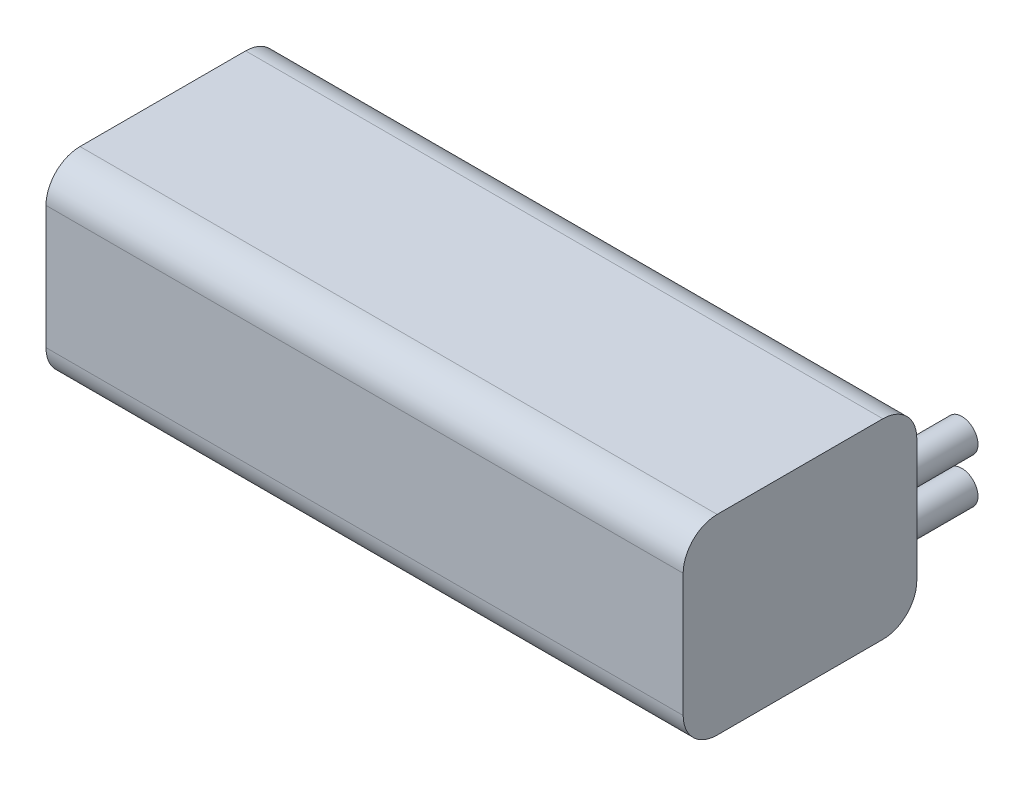
ISO-10303-21;
HEADER;
FILE_DESCRIPTION(('STEP AP214'),'2;1');
FILE_NAME('part.step','',(''),(''),'','','');
FILE_SCHEMA(('AUTOMOTIVE_DESIGN { 1 0 10303 214 1 1 1 1 }'));
ENDSEC;
DATA;
#1=APPLICATION_CONTEXT('core data for automotive mechanical design processes');
#2=APPLICATION_PROTOCOL_DEFINITION('international standard','automotive_design',2000,#1);
#3=PRODUCT_CONTEXT('',#1,'mechanical');
#4=PRODUCT('Part','Part','',(#3));
#5=PRODUCT_RELATED_PRODUCT_CATEGORY('part','',(#4));
#6=PRODUCT_DEFINITION_FORMATION('','',#4);
#7=PRODUCT_DEFINITION_CONTEXT('part definition',#1,'design');
#8=PRODUCT_DEFINITION('design','',#6,#7);
#9=PRODUCT_DEFINITION_SHAPE('','',#8);
#10=(LENGTH_UNIT() NAMED_UNIT(*) SI_UNIT(.MILLI.,.METRE.));
#11=(NAMED_UNIT(*) PLANE_ANGLE_UNIT() SI_UNIT($,.RADIAN.));
#12=(NAMED_UNIT(*) SI_UNIT($,.STERADIAN.) SOLID_ANGLE_UNIT());
#13=UNCERTAINTY_MEASURE_WITH_UNIT(LENGTH_MEASURE(1.E-05),#10,'distance_accuracy_value','');
#14=(GEOMETRIC_REPRESENTATION_CONTEXT(3) GLOBAL_UNCERTAINTY_ASSIGNED_CONTEXT((#13)) GLOBAL_UNIT_ASSIGNED_CONTEXT((#10,
#11,#12)) REPRESENTATION_CONTEXT('',''));
#15=CARTESIAN_POINT('',(0.,0.,0.));
#16=DIRECTION('',(0.,0.,1.));
#17=DIRECTION('',(1.,0.,0.));
#18=AXIS2_PLACEMENT_3D('',#15,#16,#17);
#19=CARTESIAN_POINT('',(-75.,45.,27.5));
#20=DIRECTION('',(1.,0.,0.));
#21=DIRECTION('',(0.,0.,-1.));
#22=AXIS2_PLACEMENT_3D('',#19,#20,#21);
#23=PLANE('',#22);
#24=DIRECTION('',(0.,-1.,0.));
#25=VECTOR('',#24,1.);
#26=CARTESIAN_POINT('',(-75.,45.,-27.5));
#27=LINE('',#26,#25);
#28=CARTESIAN_POINT('',(-75.,37.,-27.5));
#29=VERTEX_POINT('',#28);
#30=CARTESIAN_POINT('',(-75.,8.00000000000001,-27.5));
#31=VERTEX_POINT('',#30);
#32=EDGE_CURVE('E103',#29,#31,#27,.T.);
#33=ORIENTED_EDGE('',*,*,#32,.T.);
#34=CARTESIAN_POINT('',(-75.,8.,-19.5));
#35=DIRECTION('',(1.,0.,0.));
#36=DIRECTION('',(0.,0.,-1.));
#37=AXIS2_PLACEMENT_3D('',#34,#35,#36);
#38=CIRCLE('',#37,8.);
#39=CARTESIAN_POINT('',(-75.,0.,-19.5));
#40=VERTEX_POINT('',#39);
#41=EDGE_CURVE('E136',#31,#40,#38,.F.);
#42=ORIENTED_EDGE('',*,*,#41,.T.);
#43=DIRECTION('',(0.,0.,1.));
#44=VECTOR('',#43,1.);
#45=CARTESIAN_POINT('',(-75.,0.,27.5));
#46=LINE('',#45,#44);
#47=CARTESIAN_POINT('',(-75.,0.,19.5));
#48=VERTEX_POINT('',#47);
#49=EDGE_CURVE('E205',#40,#48,#46,.T.);
#50=ORIENTED_EDGE('',*,*,#49,.T.);
#51=CARTESIAN_POINT('',(-75.,8.,19.5));
#52=DIRECTION('',(1.,0.,0.));
#53=DIRECTION('',(0.,0.,-1.));
#54=AXIS2_PLACEMENT_3D('',#51,#52,#53);
#55=CIRCLE('',#54,8.);
#56=CARTESIAN_POINT('',(-75.,8.00000000000001,27.5));
#57=VERTEX_POINT('',#56);
#58=EDGE_CURVE('E134',#48,#57,#55,.F.);
#59=ORIENTED_EDGE('',*,*,#58,.T.);
#60=DIRECTION('',(0.,-1.,0.));
#61=VECTOR('',#60,1.);
#62=CARTESIAN_POINT('',(-75.,45.,27.5));
#63=LINE('',#62,#61);
#64=CARTESIAN_POINT('',(-75.,37.,27.5));
#65=VERTEX_POINT('',#64);
#66=EDGE_CURVE('E125',#65,#57,#63,.T.);
#67=ORIENTED_EDGE('',*,*,#66,.F.);
#68=CARTESIAN_POINT('',(-75.,37.,19.5));
#69=DIRECTION('',(1.,0.,0.));
#70=DIRECTION('',(0.,0.,-1.));
#71=AXIS2_PLACEMENT_3D('',#68,#69,#70);
#72=CIRCLE('',#71,8.);
#73=CARTESIAN_POINT('',(-75.,45.,19.5));
#74=VERTEX_POINT('',#73);
#75=EDGE_CURVE('E110',#65,#74,#72,.F.);
#76=ORIENTED_EDGE('',*,*,#75,.T.);
#77=DIRECTION('',(0.,0.,1.));
#78=VECTOR('',#77,1.);
#79=CARTESIAN_POINT('',(-75.,45.,27.5));
#80=LINE('',#79,#78);
#81=CARTESIAN_POINT('',(-75.,45.,-19.5));
#82=VERTEX_POINT('',#81);
#83=EDGE_CURVE('E105',#82,#74,#80,.T.);
#84=ORIENTED_EDGE('',*,*,#83,.F.);
#85=CARTESIAN_POINT('',(-75.,37.,-19.5));
#86=DIRECTION('',(1.,0.,0.));
#87=DIRECTION('',(0.,0.,-1.));
#88=AXIS2_PLACEMENT_3D('',#85,#86,#87);
#89=CIRCLE('',#88,8.);
#90=EDGE_CURVE('E101',#82,#29,#89,.F.);
#91=ORIENTED_EDGE('',*,*,#90,.T.);
#92=EDGE_LOOP('',(#33,#42,#50,#59,#67,#76,#84,#91));
#93=FACE_BOUND('',#92,.T.);
#94=ADVANCED_FACE('F34',(#93),#23,.F.);
#95=CARTESIAN_POINT('',(75.,45.,27.5));
#96=DIRECTION('',(0.,0.,-1.));
#97=DIRECTION('',(-1.,0.,0.));
#98=AXIS2_PLACEMENT_3D('',#95,#96,#97);
#99=PLANE('',#98);
#100=ORIENTED_EDGE('',*,*,#66,.T.);
#101=DIRECTION('',(1.,0.,0.));
#102=VECTOR('',#101,1.);
#103=CARTESIAN_POINT('',(75.,8.,27.5));
#104=LINE('',#103,#102);
#105=CARTESIAN_POINT('',(75.,8.00000000000001,27.5));
#106=VERTEX_POINT('',#105);
#107=EDGE_CURVE('E149',#57,#106,#104,.T.);
#108=ORIENTED_EDGE('',*,*,#107,.T.);
#109=DIRECTION('',(0.,-1.,0.));
#110=VECTOR('',#109,1.);
#111=CARTESIAN_POINT('',(75.,45.,27.5));
#112=LINE('',#111,#110);
#113=CARTESIAN_POINT('',(75.,37.,27.5));
#114=VERTEX_POINT('',#113);
#115=EDGE_CURVE('E129',#114,#106,#112,.T.);
#116=ORIENTED_EDGE('',*,*,#115,.F.);
#117=DIRECTION('',(1.,0.,0.));
#118=VECTOR('',#117,1.);
#119=CARTESIAN_POINT('',(-75.,37.,27.5));
#120=LINE('',#119,#118);
#121=EDGE_CURVE('E147',#114,#65,#120,.F.);
#122=ORIENTED_EDGE('',*,*,#121,.T.);
#123=EDGE_LOOP('',(#100,#108,#116,#122));
#124=FACE_BOUND('',#123,.T.);
#125=ADVANCED_FACE('F172',(#124),#99,.F.);
#126=CARTESIAN_POINT('',(75.,45.,27.5));
#127=DIRECTION('',(-1.,0.,0.));
#128=DIRECTION('',(0.,0.,1.));
#129=AXIS2_PLACEMENT_3D('',#126,#127,#128);
#130=PLANE('',#129);
#131=DIRECTION('',(0.,0.,-1.));
#132=VECTOR('',#131,1.);
#133=CARTESIAN_POINT('',(75.,0.,27.5));
#134=LINE('',#133,#132);
#135=CARTESIAN_POINT('',(75.,0.,19.5));
#136=VERTEX_POINT('',#135);
#137=CARTESIAN_POINT('',(75.,0.,-19.5));
#138=VERTEX_POINT('',#137);
#139=EDGE_CURVE('E201',#136,#138,#134,.T.);
#140=ORIENTED_EDGE('',*,*,#139,.T.);
#141=CARTESIAN_POINT('',(75.,8.,-19.5));
#142=DIRECTION('',(-1.,0.,0.));
#143=DIRECTION('',(0.,0.,1.));
#144=AXIS2_PLACEMENT_3D('',#141,#142,#143);
#145=CIRCLE('',#144,8.);
#146=CARTESIAN_POINT('',(75.,8.00000000000001,-27.5));
#147=VERTEX_POINT('',#146);
#148=EDGE_CURVE('E145',#138,#147,#145,.F.);
#149=ORIENTED_EDGE('',*,*,#148,.T.);
#150=DIRECTION('',(0.,-1.,0.));
#151=VECTOR('',#150,1.);
#152=CARTESIAN_POINT('',(75.,45.,-27.5));
#153=LINE('',#152,#151);
#154=CARTESIAN_POINT('',(75.,37.,-27.5));
#155=VERTEX_POINT('',#154);
#156=EDGE_CURVE('E120',#155,#147,#153,.T.);
#157=ORIENTED_EDGE('',*,*,#156,.F.);
#158=CARTESIAN_POINT('',(75.,37.,-19.5));
#159=DIRECTION('',(-1.,0.,0.));
#160=DIRECTION('',(0.,0.,1.));
#161=AXIS2_PLACEMENT_3D('',#158,#159,#160);
#162=CIRCLE('',#161,8.);
#163=CARTESIAN_POINT('',(75.,45.,-19.5));
#164=VERTEX_POINT('',#163);
#165=EDGE_CURVE('E124',#155,#164,#162,.F.);
#166=ORIENTED_EDGE('',*,*,#165,.T.);
#167=DIRECTION('',(0.,0.,-1.));
#168=VECTOR('',#167,1.);
#169=CARTESIAN_POINT('',(75.,45.,27.5));
#170=LINE('',#169,#168);
#171=CARTESIAN_POINT('',(75.,45.,19.5));
#172=VERTEX_POINT('',#171);
#173=EDGE_CURVE('E121',#172,#164,#170,.T.);
#174=ORIENTED_EDGE('',*,*,#173,.F.);
#175=CARTESIAN_POINT('',(75.,37.,19.5));
#176=DIRECTION('',(-1.,0.,0.));
#177=DIRECTION('',(0.,0.,1.));
#178=AXIS2_PLACEMENT_3D('',#175,#176,#177);
#179=CIRCLE('',#178,8.);
#180=EDGE_CURVE('E57',#172,#114,#179,.F.);
#181=ORIENTED_EDGE('',*,*,#180,.T.);
#182=ORIENTED_EDGE('',*,*,#115,.T.);
#183=CARTESIAN_POINT('',(75.,8.,19.5));
#184=DIRECTION('',(-1.,0.,0.));
#185=DIRECTION('',(0.,0.,1.));
#186=AXIS2_PLACEMENT_3D('',#183,#184,#185);
#187=CIRCLE('',#186,8.);
#188=EDGE_CURVE('E49',#106,#136,#187,.F.);
#189=ORIENTED_EDGE('',*,*,#188,.T.);
#190=EDGE_LOOP('',(#140,#149,#157,#166,#174,#181,#182,#189));
#191=FACE_BOUND('',#190,.T.);
#192=ADVANCED_FACE('F162',(#191),#130,.F.);
#193=CARTESIAN_POINT('',(75.,45.,-27.5));
#194=DIRECTION('',(0.,0.,1.));
#195=DIRECTION('',(1.,0.,0.));
#196=AXIS2_PLACEMENT_3D('',#193,#194,#195);
#197=PLANE('',#196);
#198=CARTESIAN_POINT('',(68.7919437537516,26.164871882159,-27.5));
#199=DIRECTION('',(0.,0.,1.));
#200=DIRECTION('',(1.,0.,0.));
#201=AXIS2_PLACEMENT_3D('',#198,#199,#200);
#202=CIRCLE('',#201,3.81);
#203=CARTESIAN_POINT('',(72.6019437537516,26.164871882159,-27.5));
#204=VERTEX_POINT('',#203);
#205=EDGE_CURVE('E11',#204,#204,#202,.F.);
#206=ORIENTED_EDGE('',*,*,#205,.F.);
#207=EDGE_LOOP('',(#206));
#208=FACE_BOUND('',#207,.T.);
#209=CARTESIAN_POINT('',(68.7919437537516,15.5817093969688,-27.5));
#210=DIRECTION('',(0.,0.,1.));
#211=DIRECTION('',(1.,0.,0.));
#212=AXIS2_PLACEMENT_3D('',#209,#210,#211);
#213=CIRCLE('',#212,3.81);
#214=CARTESIAN_POINT('',(72.6019437537516,15.5817093969688,-27.5));
#215=VERTEX_POINT('',#214);
#216=EDGE_CURVE('E42',#215,#215,#213,.F.);
#217=ORIENTED_EDGE('',*,*,#216,.F.);
#218=EDGE_LOOP('',(#217));
#219=FACE_BOUND('',#218,.T.);
#220=ORIENTED_EDGE('',*,*,#156,.T.);
#221=DIRECTION('',(-1.,0.,0.));
#222=VECTOR('',#221,1.);
#223=CARTESIAN_POINT('',(75.,8.,-27.5));
#224=LINE('',#223,#222);
#225=EDGE_CURVE('E111',#147,#31,#224,.T.);
#226=ORIENTED_EDGE('',*,*,#225,.T.);
#227=ORIENTED_EDGE('',*,*,#32,.F.);
#228=DIRECTION('',(-1.,0.,0.));
#229=VECTOR('',#228,1.);
#230=CARTESIAN_POINT('',(75.,37.,-27.5));
#231=LINE('',#230,#229);
#232=EDGE_CURVE('E117',#29,#155,#231,.F.);
#233=ORIENTED_EDGE('',*,*,#232,.T.);
#234=EDGE_LOOP('',(#220,#226,#227,#233));
#235=FACE_BOUND('',#234,.T.);
#236=ADVANCED_FACE('F116',(#208,#219,#235),#197,.F.);
#237=CARTESIAN_POINT('',(0.,45.,0.));
#238=DIRECTION('',(0.,1.,0.));
#239=DIRECTION('',(0.,0.,1.));
#240=AXIS2_PLACEMENT_3D('',#237,#238,#239);
#241=PLANE('',#240);
#242=ORIENTED_EDGE('',*,*,#83,.T.);
#243=DIRECTION('',(1.,0.,0.));
#244=VECTOR('',#243,1.);
#245=CARTESIAN_POINT('',(75.,45.,19.5));
#246=LINE('',#245,#244);
#247=EDGE_CURVE('E153',#74,#172,#246,.T.);
#248=ORIENTED_EDGE('',*,*,#247,.T.);
#249=ORIENTED_EDGE('',*,*,#173,.T.);
#250=DIRECTION('',(-1.,0.,0.));
#251=VECTOR('',#250,1.);
#252=CARTESIAN_POINT('',(-75.,45.,-19.5));
#253=LINE('',#252,#251);
#254=EDGE_CURVE('E151',#164,#82,#253,.T.);
#255=ORIENTED_EDGE('',*,*,#254,.T.);
#256=EDGE_LOOP('',(#242,#248,#249,#255));
#257=FACE_BOUND('',#256,.T.);
#258=ADVANCED_FACE('F161',(#257),#241,.T.);
#259=CARTESIAN_POINT('',(0.,0.,0.));
#260=DIRECTION('',(0.,1.,0.));
#261=DIRECTION('',(0.,0.,1.));
#262=AXIS2_PLACEMENT_3D('',#259,#260,#261);
#263=PLANE('',#262);
#264=ORIENTED_EDGE('',*,*,#49,.F.);
#265=DIRECTION('',(-1.,0.,0.));
#266=VECTOR('',#265,1.);
#267=CARTESIAN_POINT('',(0.,0.,-19.5));
#268=LINE('',#267,#266);
#269=EDGE_CURVE('E140',#40,#138,#268,.F.);
#270=ORIENTED_EDGE('',*,*,#269,.T.);
#271=ORIENTED_EDGE('',*,*,#139,.F.);
#272=DIRECTION('',(1.,0.,0.));
#273=VECTOR('',#272,1.);
#274=CARTESIAN_POINT('',(0.,0.,19.5));
#275=LINE('',#274,#273);
#276=EDGE_CURVE('E138',#136,#48,#275,.F.);
#277=ORIENTED_EDGE('',*,*,#276,.T.);
#278=EDGE_LOOP('',(#264,#270,#271,#277));
#279=FACE_BOUND('',#278,.T.);
#280=ADVANCED_FACE('F169',(#279),#263,.F.);
#281=CARTESIAN_POINT('',(75.,8.,-19.5));
#282=DIRECTION('',(-1.,0.,0.));
#283=DIRECTION('',(0.,0.,1.));
#284=AXIS2_PLACEMENT_3D('',#281,#282,#283);
#285=CYLINDRICAL_SURFACE('',#284,8.);
#286=ORIENTED_EDGE('',*,*,#148,.F.);
#287=ORIENTED_EDGE('',*,*,#269,.F.);
#288=ORIENTED_EDGE('',*,*,#41,.F.);
#289=ORIENTED_EDGE('',*,*,#225,.F.);
#290=EDGE_LOOP('',(#286,#287,#288,#289));
#291=FACE_BOUND('',#290,.T.);
#292=ADVANCED_FACE('F184',(#291),#285,.T.);
#293=CARTESIAN_POINT('',(75.,8.,19.5));
#294=DIRECTION('',(1.,0.,0.));
#295=DIRECTION('',(0.,0.,-1.));
#296=AXIS2_PLACEMENT_3D('',#293,#294,#295);
#297=CYLINDRICAL_SURFACE('',#296,8.);
#298=ORIENTED_EDGE('',*,*,#58,.F.);
#299=ORIENTED_EDGE('',*,*,#276,.F.);
#300=ORIENTED_EDGE('',*,*,#188,.F.);
#301=ORIENTED_EDGE('',*,*,#107,.F.);
#302=EDGE_LOOP('',(#298,#299,#300,#301));
#303=FACE_BOUND('',#302,.T.);
#304=ADVANCED_FACE('F187',(#303),#297,.T.);
#305=CARTESIAN_POINT('',(0.,37.,19.5));
#306=DIRECTION('',(-1.,0.,0.));
#307=DIRECTION('',(0.,0.,1.));
#308=AXIS2_PLACEMENT_3D('',#305,#306,#307);
#309=CYLINDRICAL_SURFACE('',#308,8.);
#310=ORIENTED_EDGE('',*,*,#75,.F.);
#311=ORIENTED_EDGE('',*,*,#121,.F.);
#312=ORIENTED_EDGE('',*,*,#180,.F.);
#313=ORIENTED_EDGE('',*,*,#247,.F.);
#314=EDGE_LOOP('',(#310,#311,#312,#313));
#315=FACE_BOUND('',#314,.T.);
#316=ADVANCED_FACE('F190',(#315),#309,.T.);
#317=CARTESIAN_POINT('',(0.,37.,-19.5));
#318=DIRECTION('',(1.,0.,0.));
#319=DIRECTION('',(0.,0.,-1.));
#320=AXIS2_PLACEMENT_3D('',#317,#318,#319);
#321=CYLINDRICAL_SURFACE('',#320,8.);
#322=ORIENTED_EDGE('',*,*,#165,.F.);
#323=ORIENTED_EDGE('',*,*,#232,.F.);
#324=ORIENTED_EDGE('',*,*,#90,.F.);
#325=ORIENTED_EDGE('',*,*,#254,.F.);
#326=EDGE_LOOP('',(#322,#323,#324,#325));
#327=FACE_BOUND('',#326,.T.);
#328=ADVANCED_FACE('F36',(#327),#321,.T.);
#329=CARTESIAN_POINT('',(68.7919437537516,15.5817093969688,-44.306));
#330=DIRECTION('',(0.,0.,1.));
#331=DIRECTION('',(1.,0.,0.));
#332=AXIS2_PLACEMENT_3D('',#329,#330,#331);
#333=CYLINDRICAL_SURFACE('',#332,3.81);
#334=CARTESIAN_POINT('',(68.7919437537516,15.5817093969688,-44.306));
#335=DIRECTION('',(0.,0.,-1.));
#336=DIRECTION('',(-1.,0.,0.));
#337=AXIS2_PLACEMENT_3D('',#334,#335,#336);
#338=CIRCLE('',#337,3.81);
#339=CARTESIAN_POINT('',(64.9819437537517,15.5817093969688,-44.306));
#340=VERTEX_POINT('',#339);
#341=EDGE_CURVE('E208',#340,#340,#338,.T.);
#342=ORIENTED_EDGE('',*,*,#341,.F.);
#343=EDGE_LOOP('',(#342));
#344=FACE_BOUND('',#343,.T.);
#345=ORIENTED_EDGE('',*,*,#216,.T.);
#346=EDGE_LOOP('',(#345));
#347=FACE_BOUND('',#346,.T.);
#348=ADVANCED_FACE('F158',(#344,#347),#333,.T.);
#349=CARTESIAN_POINT('',(68.7919437537516,15.5817093969688,-44.306));
#350=DIRECTION('',(0.,0.,-1.));
#351=DIRECTION('',(-1.,0.,0.));
#352=AXIS2_PLACEMENT_3D('',#349,#350,#351);
#353=PLANE('',#352);
#354=ORIENTED_EDGE('',*,*,#341,.T.);
#355=EDGE_LOOP('',(#354));
#356=FACE_BOUND('',#355,.T.);
#357=ADVANCED_FACE('F225',(#356),#353,.T.);
#358=CARTESIAN_POINT('',(68.7919437537516,26.164871882159,-44.306));
#359=DIRECTION('',(0.,0.,1.));
#360=DIRECTION('',(1.,0.,0.));
#361=AXIS2_PLACEMENT_3D('',#358,#359,#360);
#362=CYLINDRICAL_SURFACE('',#361,3.81);
#363=CARTESIAN_POINT('',(68.7919437537516,26.164871882159,-44.306));
#364=DIRECTION('',(0.,0.,-1.));
#365=DIRECTION('',(-1.,0.,0.));
#366=AXIS2_PLACEMENT_3D('',#363,#364,#365);
#367=CIRCLE('',#366,3.81);
#368=CARTESIAN_POINT('',(64.9819437537517,26.164871882159,-44.306));
#369=VERTEX_POINT('',#368);
#370=EDGE_CURVE('E241',#369,#369,#367,.T.);
#371=ORIENTED_EDGE('',*,*,#370,.F.);
#372=EDGE_LOOP('',(#371));
#373=FACE_BOUND('',#372,.T.);
#374=ORIENTED_EDGE('',*,*,#205,.T.);
#375=EDGE_LOOP('',(#374));
#376=FACE_BOUND('',#375,.T.);
#377=ADVANCED_FACE('F229',(#373,#376),#362,.T.);
#378=CARTESIAN_POINT('',(68.7919437537516,26.164871882159,-44.306));
#379=DIRECTION('',(0.,0.,-1.));
#380=DIRECTION('',(-1.,0.,0.));
#381=AXIS2_PLACEMENT_3D('',#378,#379,#380);
#382=PLANE('',#381);
#383=ORIENTED_EDGE('',*,*,#370,.T.);
#384=EDGE_LOOP('',(#383));
#385=FACE_BOUND('',#384,.T.);
#386=ADVANCED_FACE('F233',(#385),#382,.T.);
#387=CLOSED_SHELL('',(#94,#125,#192,#236,#258,#280,#292,#304,#316,#328,#348,#357,#377,#386));
#388=MANIFOLD_SOLID_BREP('B2',#387);
#389=ADVANCED_BREP_SHAPE_REPRESENTATION('',(#18,#388),#14);
#390=SHAPE_DEFINITION_REPRESENTATION(#9,#389);
ENDSEC;
END-ISO-10303-21;
